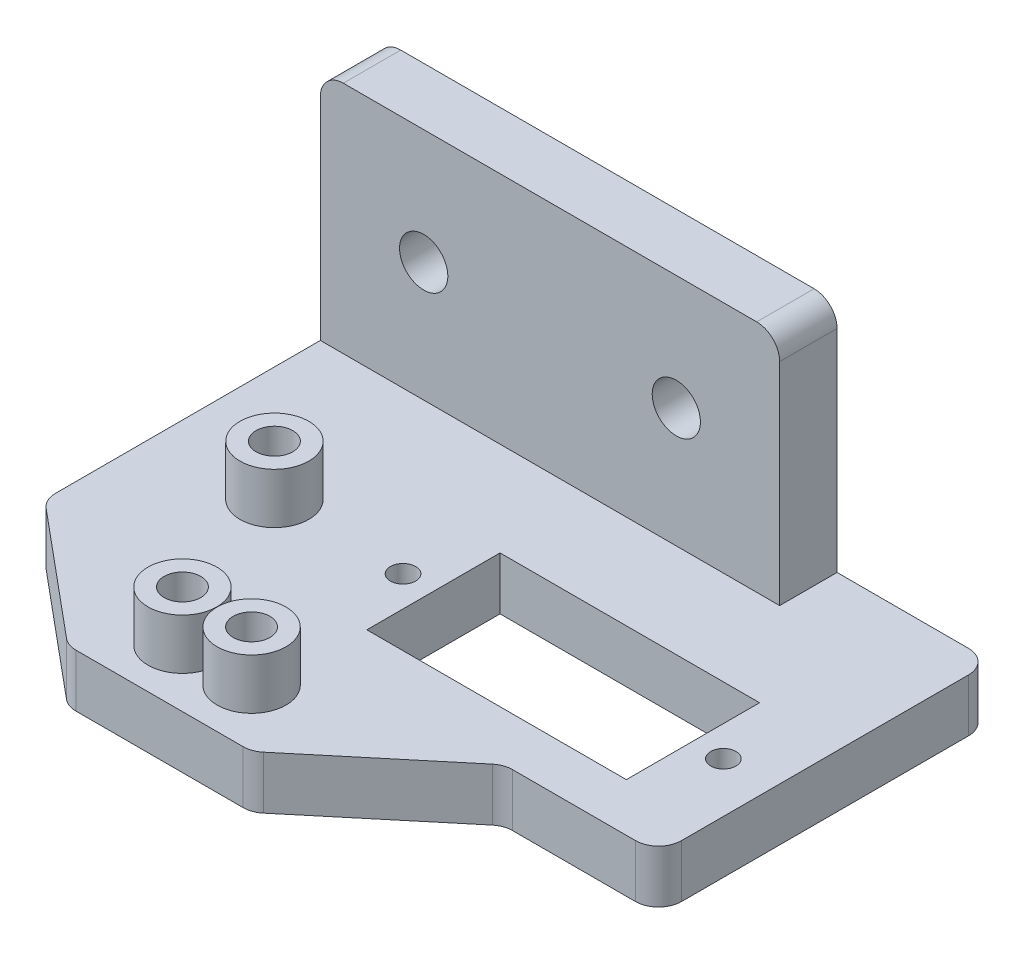
ISO-10303-21;
HEADER;
FILE_DESCRIPTION(('STEP AP214'),'2;1');
FILE_NAME('part.step','',(''),(''),'','','');
FILE_SCHEMA(('AUTOMOTIVE_DESIGN { 1 0 10303 214 1 1 1 1 }'));
ENDSEC;
DATA;
#1=APPLICATION_CONTEXT('core data for automotive mechanical design processes');
#2=APPLICATION_PROTOCOL_DEFINITION('international standard','automotive_design',2000,#1);
#3=PRODUCT_CONTEXT('',#1,'mechanical');
#4=PRODUCT('Part','Part','',(#3));
#5=PRODUCT_RELATED_PRODUCT_CATEGORY('part','',(#4));
#6=PRODUCT_DEFINITION_FORMATION('','',#4);
#7=PRODUCT_DEFINITION_CONTEXT('part definition',#1,'design');
#8=PRODUCT_DEFINITION('design','',#6,#7);
#9=PRODUCT_DEFINITION_SHAPE('','',#8);
#10=(LENGTH_UNIT() NAMED_UNIT(*) SI_UNIT(.MILLI.,.METRE.));
#11=(NAMED_UNIT(*) PLANE_ANGLE_UNIT() SI_UNIT($,.RADIAN.));
#12=(NAMED_UNIT(*) SI_UNIT($,.STERADIAN.) SOLID_ANGLE_UNIT());
#13=UNCERTAINTY_MEASURE_WITH_UNIT(LENGTH_MEASURE(1.E-05),#10,'distance_accuracy_value','');
#14=(GEOMETRIC_REPRESENTATION_CONTEXT(3) GLOBAL_UNCERTAINTY_ASSIGNED_CONTEXT((#13)) GLOBAL_UNIT_ASSIGNED_CONTEXT((#10,
#11,#12)) REPRESENTATION_CONTEXT('',''));
#15=CARTESIAN_POINT('',(0.,0.,0.));
#16=DIRECTION('',(0.,0.,1.));
#17=DIRECTION('',(1.,0.,0.));
#18=AXIS2_PLACEMENT_3D('',#15,#16,#17);
#19=CARTESIAN_POINT('',(0.,4.6,0.));
#20=DIRECTION('',(0.,1.,0.));
#21=DIRECTION('',(0.,0.,1.));
#22=AXIS2_PLACEMENT_3D('',#19,#20,#21);
#23=PLANE('',#22);
#24=DIRECTION('',(0.,0.,-1.));
#25=VECTOR('',#24,1.);
#26=CARTESIAN_POINT('',(52.,4.6,-1.5));
#27=LINE('',#26,#25);
#28=CARTESIAN_POINT('',(52.,4.6,25.5));
#29=VERTEX_POINT('',#28);
#30=CARTESIAN_POINT('',(52.,4.6,0.5));
#31=VERTEX_POINT('',#30);
#32=EDGE_CURVE('E540',#29,#31,#27,.T.);
#33=ORIENTED_EDGE('',*,*,#32,.T.);
#34=CARTESIAN_POINT('',(50.,4.6,0.5));
#35=DIRECTION('',(0.,1.,0.));
#36=DIRECTION('',(0.,0.,1.));
#37=AXIS2_PLACEMENT_3D('',#34,#35,#36);
#38=CIRCLE('',#37,2.);
#39=CARTESIAN_POINT('',(50.,4.6,-1.5));
#40=VERTEX_POINT('',#39);
#41=EDGE_CURVE('E374',#31,#40,#38,.T.);
#42=ORIENTED_EDGE('',*,*,#41,.T.);
#43=DIRECTION('',(-1.,0.,0.));
#44=VECTOR('',#43,1.);
#45=CARTESIAN_POINT('',(0.,4.6,-1.5));
#46=LINE('',#45,#44);
#47=CARTESIAN_POINT('',(38.55,4.6,-1.5));
#48=VERTEX_POINT('',#47);
#49=EDGE_CURVE('E245',#40,#48,#46,.T.);
#50=ORIENTED_EDGE('',*,*,#49,.T.);
#51=DIRECTION('',(0.,0.,-1.));
#52=VECTOR('',#51,1.);
#53=CARTESIAN_POINT('',(38.55,4.6,-1.5));
#54=LINE('',#53,#52);
#55=CARTESIAN_POINT('',(38.55,4.6,3.5));
#56=VERTEX_POINT('',#55);
#57=EDGE_CURVE('E219',#56,#48,#54,.T.);
#58=ORIENTED_EDGE('',*,*,#57,.F.);
#59=DIRECTION('',(1.,0.,0.));
#60=VECTOR('',#59,1.);
#61=CARTESIAN_POINT('',(-1.45,4.6,3.5));
#62=LINE('',#61,#60);
#63=CARTESIAN_POINT('',(-1.45,4.6,3.5));
#64=VERTEX_POINT('',#63);
#65=EDGE_CURVE('E197',#64,#56,#62,.T.);
#66=ORIENTED_EDGE('',*,*,#65,.F.);
#67=DIRECTION('',(0.,0.,1.));
#68=VECTOR('',#67,1.);
#69=CARTESIAN_POINT('',(-1.45,4.6,-1.5));
#70=LINE('',#69,#68);
#71=CARTESIAN_POINT('',(-1.45,4.6,26.5637500497888));
#72=VERTEX_POINT('',#71);
#73=EDGE_CURVE('E201',#64,#72,#70,.T.);
#74=ORIENTED_EDGE('',*,*,#73,.T.);
#75=CARTESIAN_POINT('',(0.550000000000004,4.6,26.5637500497888));
#76=DIRECTION('',(0.,1.,0.));
#77=DIRECTION('',(0.,0.,1.));
#78=AXIS2_PLACEMENT_3D('',#75,#76,#77);
#79=CIRCLE('',#78,2.);
#80=CARTESIAN_POINT('',(-0.73099869105042,4.6,28.0996674803583));
#81=VERTEX_POINT('',#80);
#82=EDGE_CURVE('E362',#72,#81,#79,.T.);
#83=ORIENTED_EDGE('',*,*,#82,.T.);
#84=DIRECTION('',(-0.767958715284731,0.,-0.640499345525213));
#85=VECTOR('',#84,1.);
#86=CARTESIAN_POINT('',(10.54,4.6,37.5));
#87=LINE('',#86,#85);
#88=CARTESIAN_POINT('',(9.98356499925279,4.6,37.0359174305695));
#89=VERTEX_POINT('',#88);
#90=EDGE_CURVE('E532',#89,#81,#87,.T.);
#91=ORIENTED_EDGE('',*,*,#90,.F.);
#92=CARTESIAN_POINT('',(11.2645636903032,4.6,35.5));
#93=DIRECTION('',(0.,1.,0.));
#94=DIRECTION('',(0.,0.,1.));
#95=AXIS2_PLACEMENT_3D('',#92,#93,#94);
#96=CIRCLE('',#95,2.);
#97=CARTESIAN_POINT('',(11.2645636903032,4.6,37.5));
#98=VERTEX_POINT('',#97);
#99=EDGE_CURVE('E365',#89,#98,#96,.T.);
#100=ORIENTED_EDGE('',*,*,#99,.T.);
#101=DIRECTION('',(1.,0.,0.));
#102=VECTOR('',#101,1.);
#103=CARTESIAN_POINT('',(0.,4.6,37.5));
#104=LINE('',#103,#102);
#105=CARTESIAN_POINT('',(25.8354178395591,4.6,37.5));
#106=VERTEX_POINT('',#105);
#107=EDGE_CURVE('E256',#98,#106,#104,.T.);
#108=ORIENTED_EDGE('',*,*,#107,.T.);
#109=CARTESIAN_POINT('',(25.8354178395591,4.6,35.5));
#110=DIRECTION('',(0.,1.,0.));
#111=DIRECTION('',(0.,0.,1.));
#112=AXIS2_PLACEMENT_3D('',#109,#110,#111);
#113=CIRCLE('',#112,2.);
#114=CARTESIAN_POINT('',(27.1164416076271,4.6,37.0358965152786));
#115=VERTEX_POINT('',#114);
#116=EDGE_CURVE('E368',#106,#115,#113,.T.);
#117=ORIENTED_EDGE('',*,*,#116,.T.);
#118=DIRECTION('',(-0.767948257639299,0.,0.640511884033985));
#119=VECTOR('',#118,1.);
#120=CARTESIAN_POINT('',(26.56,4.6,37.5));
#121=LINE('',#120,#119);
#122=CARTESIAN_POINT('',(37.9931604088525,4.6,27.9641034847214));
#123=VERTEX_POINT('',#122);
#124=EDGE_CURVE('E543',#123,#115,#121,.T.);
#125=ORIENTED_EDGE('',*,*,#124,.F.);
#126=CARTESIAN_POINT('',(39.2741841769205,4.6,29.5));
#127=DIRECTION('',(0.,1.,0.));
#128=DIRECTION('',(0.,0.,1.));
#129=AXIS2_PLACEMENT_3D('',#126,#127,#128);
#130=CIRCLE('',#129,2.);
#131=CARTESIAN_POINT('',(39.2741841769205,4.6,27.5));
#132=VERTEX_POINT('',#131);
#133=EDGE_CURVE('E425',#123,#132,#130,.F.);
#134=ORIENTED_EDGE('',*,*,#133,.T.);
#135=DIRECTION('',(-1.,0.,0.));
#136=VECTOR('',#135,1.);
#137=CARTESIAN_POINT('',(38.5496020164796,4.6,27.5));
#138=LINE('',#137,#136);
#139=CARTESIAN_POINT('',(50.,4.6,27.5));
#140=VERTEX_POINT('',#139);
#141=EDGE_CURVE('E536',#140,#132,#138,.T.);
#142=ORIENTED_EDGE('',*,*,#141,.F.);
#143=CARTESIAN_POINT('',(50.,4.6,25.5));
#144=DIRECTION('',(0.,1.,0.));
#145=DIRECTION('',(0.,0.,1.));
#146=AXIS2_PLACEMENT_3D('',#143,#144,#145);
#147=CIRCLE('',#146,2.);
#148=EDGE_CURVE('E371',#140,#29,#147,.T.);
#149=ORIENTED_EDGE('',*,*,#148,.T.);
#150=EDGE_LOOP('',(#33,#42,#50,#58,#66,#74,#83,#91,#100,#108,#117,#125,#134,#142,#149));
#151=FACE_BOUND('',#150,.T.);
#152=CARTESIAN_POINT('',(47.65,4.6,17.5));
#153=DIRECTION('',(0.,1.,0.));
#154=DIRECTION('',(0.,0.,1.));
#155=AXIS2_PLACEMENT_3D('',#152,#153,#154);
#156=CIRCLE('',#155,1.1);
#157=CARTESIAN_POINT('',(47.65,4.6,18.6));
#158=VERTEX_POINT('',#157);
#159=EDGE_CURVE('E569',#158,#158,#156,.T.);
#160=ORIENTED_EDGE('',*,*,#159,.F.);
#161=EDGE_LOOP('',(#160));
#162=FACE_BOUND('',#161,.T.);
#163=CARTESIAN_POINT('',(19.75,4.6,17.5));
#164=DIRECTION('',(0.,1.,0.));
#165=DIRECTION('',(0.,0.,1.));
#166=AXIS2_PLACEMENT_3D('',#163,#164,#165);
#167=CIRCLE('',#166,1.1);
#168=CARTESIAN_POINT('',(19.75,4.6,18.6));
#169=VERTEX_POINT('',#168);
#170=EDGE_CURVE('E573',#169,#169,#167,.T.);
#171=ORIENTED_EDGE('',*,*,#170,.F.);
#172=EDGE_LOOP('',(#171));
#173=FACE_BOUND('',#172,.T.);
#174=CARTESIAN_POINT('',(21.56,4.6,32.5));
#175=DIRECTION('',(0.,1.,0.));
#176=DIRECTION('',(0.,0.,1.));
#177=AXIS2_PLACEMENT_3D('',#174,#175,#176);
#178=CIRCLE('',#177,3.);
#179=CARTESIAN_POINT('',(21.56,4.6,35.5));
#180=VERTEX_POINT('',#179);
#181=EDGE_CURVE('E284',#180,#180,#178,.T.);
#182=ORIENTED_EDGE('',*,*,#181,.F.);
#183=EDGE_LOOP('',(#182));
#184=FACE_BOUND('',#183,.T.);
#185=CARTESIAN_POINT('',(8.55000000000001,4.6,17.5));
#186=DIRECTION('',(0.,1.,0.));
#187=DIRECTION('',(0.,0.,1.));
#188=AXIS2_PLACEMENT_3D('',#185,#186,#187);
#189=CIRCLE('',#188,3.);
#190=CARTESIAN_POINT('',(8.55000000000001,4.6,20.5));
#191=VERTEX_POINT('',#190);
#192=EDGE_CURVE('E304',#191,#191,#189,.T.);
#193=ORIENTED_EDGE('',*,*,#192,.F.);
#194=EDGE_LOOP('',(#193));
#195=FACE_BOUND('',#194,.T.);
#196=DIRECTION('',(0.,0.,1.));
#197=VECTOR('',#196,1.);
#198=CARTESIAN_POINT('',(22.4,4.6,11.7));
#199=LINE('',#198,#197);
#200=CARTESIAN_POINT('',(22.4,4.6,11.7));
#201=VERTEX_POINT('',#200);
#202=CARTESIAN_POINT('',(22.4,4.6,23.3));
#203=VERTEX_POINT('',#202);
#204=EDGE_CURVE('E303',#201,#203,#199,.T.);
#205=ORIENTED_EDGE('',*,*,#204,.F.);
#206=DIRECTION('',(-1.,0.,0.));
#207=VECTOR('',#206,1.);
#208=CARTESIAN_POINT('',(22.4,4.6,11.7));
#209=LINE('',#208,#207);
#210=CARTESIAN_POINT('',(45.,4.6,11.7));
#211=VERTEX_POINT('',#210);
#212=EDGE_CURVE('E315',#211,#201,#209,.T.);
#213=ORIENTED_EDGE('',*,*,#212,.F.);
#214=DIRECTION('',(0.,0.,-1.));
#215=VECTOR('',#214,1.);
#216=CARTESIAN_POINT('',(45.,4.6,11.7));
#217=LINE('',#216,#215);
#218=CARTESIAN_POINT('',(45.,4.6,23.3));
#219=VERTEX_POINT('',#218);
#220=EDGE_CURVE('E334',#219,#211,#217,.T.);
#221=ORIENTED_EDGE('',*,*,#220,.F.);
#222=DIRECTION('',(1.,0.,0.));
#223=VECTOR('',#222,1.);
#224=CARTESIAN_POINT('',(22.4,4.6,23.3));
#225=LINE('',#224,#223);
#226=EDGE_CURVE('E330',#203,#219,#225,.T.);
#227=ORIENTED_EDGE('',*,*,#226,.F.);
#228=EDGE_LOOP('',(#205,#213,#221,#227));
#229=FACE_BOUND('',#228,.T.);
#230=CARTESIAN_POINT('',(15.54,4.6,32.5));
#231=DIRECTION('',(0.,1.,0.));
#232=DIRECTION('',(0.,0.,1.));
#233=AXIS2_PLACEMENT_3D('',#230,#231,#232);
#234=CIRCLE('',#233,3.);
#235=CARTESIAN_POINT('',(15.54,4.6,35.5));
#236=VERTEX_POINT('',#235);
#237=EDGE_CURVE('E292',#236,#236,#234,.T.);
#238=ORIENTED_EDGE('',*,*,#237,.F.);
#239=EDGE_LOOP('',(#238));
#240=FACE_BOUND('',#239,.T.);
#241=ADVANCED_FACE('F45',(#151,#162,#173,#184,#195,#229,#240),#23,.T.);
#242=CARTESIAN_POINT('',(0.,0.,0.));
#243=DIRECTION('',(0.,1.,0.));
#244=DIRECTION('',(0.,0.,1.));
#245=AXIS2_PLACEMENT_3D('',#242,#243,#244);
#246=PLANE('',#245);
#247=CARTESIAN_POINT('',(47.65,0.,17.5));
#248=DIRECTION('',(0.,1.,0.));
#249=DIRECTION('',(0.,0.,1.));
#250=AXIS2_PLACEMENT_3D('',#247,#248,#249);
#251=CIRCLE('',#250,1.1);
#252=CARTESIAN_POINT('',(47.65,0.,18.6));
#253=VERTEX_POINT('',#252);
#254=EDGE_CURVE('E564',#253,#253,#251,.T.);
#255=ORIENTED_EDGE('',*,*,#254,.T.);
#256=EDGE_LOOP('',(#255));
#257=FACE_BOUND('',#256,.T.);
#258=CARTESIAN_POINT('',(19.75,0.,17.5));
#259=DIRECTION('',(0.,1.,0.));
#260=DIRECTION('',(0.,0.,1.));
#261=AXIS2_PLACEMENT_3D('',#258,#259,#260);
#262=CIRCLE('',#261,1.1);
#263=CARTESIAN_POINT('',(19.75,0.,18.6));
#264=VERTEX_POINT('',#263);
#265=EDGE_CURVE('E561',#264,#264,#262,.T.);
#266=ORIENTED_EDGE('',*,*,#265,.T.);
#267=EDGE_LOOP('',(#266));
#268=FACE_BOUND('',#267,.T.);
#269=CARTESIAN_POINT('',(8.55000000000001,0.,17.5));
#270=DIRECTION('',(0.,1.,0.));
#271=DIRECTION('',(0.,0.,1.));
#272=AXIS2_PLACEMENT_3D('',#269,#270,#271);
#273=CIRCLE('',#272,1.6);
#274=CARTESIAN_POINT('',(8.55000000000001,0.,19.1));
#275=VERTEX_POINT('',#274);
#276=EDGE_CURVE('E252',#275,#275,#273,.T.);
#277=ORIENTED_EDGE('',*,*,#276,.T.);
#278=EDGE_LOOP('',(#277));
#279=FACE_BOUND('',#278,.T.);
#280=CARTESIAN_POINT('',(15.54,0.,32.5));
#281=DIRECTION('',(0.,1.,0.));
#282=DIRECTION('',(0.,0.,1.));
#283=AXIS2_PLACEMENT_3D('',#280,#281,#282);
#284=CIRCLE('',#283,1.6);
#285=CARTESIAN_POINT('',(15.54,0.,34.1));
#286=VERTEX_POINT('',#285);
#287=EDGE_CURVE('E265',#286,#286,#284,.T.);
#288=ORIENTED_EDGE('',*,*,#287,.T.);
#289=EDGE_LOOP('',(#288));
#290=FACE_BOUND('',#289,.T.);
#291=CARTESIAN_POINT('',(21.56,0.,32.5));
#292=DIRECTION('',(0.,1.,0.));
#293=DIRECTION('',(0.,0.,1.));
#294=AXIS2_PLACEMENT_3D('',#291,#292,#293);
#295=CIRCLE('',#294,1.6);
#296=CARTESIAN_POINT('',(21.56,0.,34.1));
#297=VERTEX_POINT('',#296);
#298=EDGE_CURVE('E249',#297,#297,#295,.T.);
#299=ORIENTED_EDGE('',*,*,#298,.T.);
#300=EDGE_LOOP('',(#299));
#301=FACE_BOUND('',#300,.T.);
#302=DIRECTION('',(-1.,0.,0.));
#303=VECTOR('',#302,1.);
#304=CARTESIAN_POINT('',(22.4,0.,11.7));
#305=LINE('',#304,#303);
#306=CARTESIAN_POINT('',(45.,0.,11.7));
#307=VERTEX_POINT('',#306);
#308=CARTESIAN_POINT('',(22.4,0.,11.7));
#309=VERTEX_POINT('',#308);
#310=EDGE_CURVE('E323',#307,#309,#305,.T.);
#311=ORIENTED_EDGE('',*,*,#310,.T.);
#312=DIRECTION('',(0.,0.,1.));
#313=VECTOR('',#312,1.);
#314=CARTESIAN_POINT('',(22.4,0.,11.7));
#315=LINE('',#314,#313);
#316=CARTESIAN_POINT('',(22.4,0.,23.3));
#317=VERTEX_POINT('',#316);
#318=EDGE_CURVE('E310',#309,#317,#315,.T.);
#319=ORIENTED_EDGE('',*,*,#318,.T.);
#320=DIRECTION('',(1.,0.,0.));
#321=VECTOR('',#320,1.);
#322=CARTESIAN_POINT('',(22.4,0.,23.3));
#323=LINE('',#322,#321);
#324=CARTESIAN_POINT('',(45.,0.,23.3));
#325=VERTEX_POINT('',#324);
#326=EDGE_CURVE('E314',#317,#325,#323,.T.);
#327=ORIENTED_EDGE('',*,*,#326,.T.);
#328=DIRECTION('',(0.,0.,-1.));
#329=VECTOR('',#328,1.);
#330=CARTESIAN_POINT('',(45.,0.,11.7));
#331=LINE('',#330,#329);
#332=EDGE_CURVE('E319',#325,#307,#331,.T.);
#333=ORIENTED_EDGE('',*,*,#332,.T.);
#334=EDGE_LOOP('',(#311,#319,#327,#333));
#335=FACE_BOUND('',#334,.T.);
#336=DIRECTION('',(-1.,0.,0.));
#337=VECTOR('',#336,1.);
#338=CARTESIAN_POINT('',(0.,0.,-1.5));
#339=LINE('',#338,#337);
#340=CARTESIAN_POINT('',(50.,0.,-1.5));
#341=VERTEX_POINT('',#340);
#342=CARTESIAN_POINT('',(-1.45,0.,-1.5));
#343=VERTEX_POINT('',#342);
#344=EDGE_CURVE('E246',#341,#343,#339,.T.);
#345=ORIENTED_EDGE('',*,*,#344,.F.);
#346=CARTESIAN_POINT('',(50.,0.,0.5));
#347=DIRECTION('',(0.,1.,0.));
#348=DIRECTION('',(0.,0.,1.));
#349=AXIS2_PLACEMENT_3D('',#346,#347,#348);
#350=CIRCLE('',#349,2.);
#351=CARTESIAN_POINT('',(52.,0.,0.5));
#352=VERTEX_POINT('',#351);
#353=EDGE_CURVE('E392',#341,#352,#350,.F.);
#354=ORIENTED_EDGE('',*,*,#353,.T.);
#355=DIRECTION('',(0.,0.,-1.));
#356=VECTOR('',#355,1.);
#357=CARTESIAN_POINT('',(52.,0.,-1.5));
#358=LINE('',#357,#356);
#359=CARTESIAN_POINT('',(52.,0.,25.5));
#360=VERTEX_POINT('',#359);
#361=EDGE_CURVE('E557',#360,#352,#358,.T.);
#362=ORIENTED_EDGE('',*,*,#361,.F.);
#363=CARTESIAN_POINT('',(50.,0.,25.5));
#364=DIRECTION('',(0.,1.,0.));
#365=DIRECTION('',(0.,0.,1.));
#366=AXIS2_PLACEMENT_3D('',#363,#364,#365);
#367=CIRCLE('',#366,2.);
#368=CARTESIAN_POINT('',(50.,0.,27.5));
#369=VERTEX_POINT('',#368);
#370=EDGE_CURVE('E389',#360,#369,#367,.F.);
#371=ORIENTED_EDGE('',*,*,#370,.T.);
#372=DIRECTION('',(-1.,0.,0.));
#373=VECTOR('',#372,1.);
#374=CARTESIAN_POINT('',(38.5496020164796,0.,27.5));
#375=LINE('',#374,#373);
#376=CARTESIAN_POINT('',(39.2741841769205,0.,27.5));
#377=VERTEX_POINT('',#376);
#378=EDGE_CURVE('E548',#369,#377,#375,.T.);
#379=ORIENTED_EDGE('',*,*,#378,.T.);
#380=CARTESIAN_POINT('',(39.2741841769205,0.,29.5));
#381=DIRECTION('',(0.,1.,0.));
#382=DIRECTION('',(0.,0.,1.));
#383=AXIS2_PLACEMENT_3D('',#380,#381,#382);
#384=CIRCLE('',#383,2.);
#385=CARTESIAN_POINT('',(37.9931604088525,0.,27.9641034847214));
#386=VERTEX_POINT('',#385);
#387=EDGE_CURVE('E428',#377,#386,#384,.T.);
#388=ORIENTED_EDGE('',*,*,#387,.T.);
#389=DIRECTION('',(-0.767948257639299,0.,0.640511884033985));
#390=VECTOR('',#389,1.);
#391=CARTESIAN_POINT('',(26.56,0.,37.5));
#392=LINE('',#391,#390);
#393=CARTESIAN_POINT('',(27.1164416076271,0.,37.0358965152786));
#394=VERTEX_POINT('',#393);
#395=EDGE_CURVE('E550',#386,#394,#392,.T.);
#396=ORIENTED_EDGE('',*,*,#395,.T.);
#397=CARTESIAN_POINT('',(25.8354178395591,0.,35.5));
#398=DIRECTION('',(0.,1.,0.));
#399=DIRECTION('',(0.,0.,1.));
#400=AXIS2_PLACEMENT_3D('',#397,#398,#399);
#401=CIRCLE('',#400,2.);
#402=CARTESIAN_POINT('',(25.8354178395591,0.,37.5));
#403=VERTEX_POINT('',#402);
#404=EDGE_CURVE('E386',#394,#403,#401,.F.);
#405=ORIENTED_EDGE('',*,*,#404,.T.);
#406=DIRECTION('',(1.,0.,0.));
#407=VECTOR('',#406,1.);
#408=CARTESIAN_POINT('',(0.,0.,37.5));
#409=LINE('',#408,#407);
#410=CARTESIAN_POINT('',(11.2645636903032,0.,37.5));
#411=VERTEX_POINT('',#410);
#412=EDGE_CURVE('E276',#411,#403,#409,.T.);
#413=ORIENTED_EDGE('',*,*,#412,.F.);
#414=CARTESIAN_POINT('',(11.2645636903032,0.,35.5));
#415=DIRECTION('',(0.,1.,0.));
#416=DIRECTION('',(0.,0.,1.));
#417=AXIS2_PLACEMENT_3D('',#414,#415,#416);
#418=CIRCLE('',#417,2.);
#419=CARTESIAN_POINT('',(9.98356499925279,0.,37.0359174305695));
#420=VERTEX_POINT('',#419);
#421=EDGE_CURVE('E383',#411,#420,#418,.F.);
#422=ORIENTED_EDGE('',*,*,#421,.T.);
#423=DIRECTION('',(-0.767958715284731,0.,-0.640499345525213));
#424=VECTOR('',#423,1.);
#425=CARTESIAN_POINT('',(10.54,0.,37.5));
#426=LINE('',#425,#424);
#427=CARTESIAN_POINT('',(-0.73099869105042,0.,28.0996674803583));
#428=VERTEX_POINT('',#427);
#429=EDGE_CURVE('E528',#420,#428,#426,.T.);
#430=ORIENTED_EDGE('',*,*,#429,.T.);
#431=CARTESIAN_POINT('',(0.550000000000004,0.,26.5637500497888));
#432=DIRECTION('',(0.,1.,0.));
#433=DIRECTION('',(0.,0.,1.));
#434=AXIS2_PLACEMENT_3D('',#431,#432,#433);
#435=CIRCLE('',#434,2.);
#436=CARTESIAN_POINT('',(-1.45,0.,26.5637500497888));
#437=VERTEX_POINT('',#436);
#438=EDGE_CURVE('E380',#428,#437,#435,.F.);
#439=ORIENTED_EDGE('',*,*,#438,.T.);
#440=DIRECTION('',(0.,0.,1.));
#441=VECTOR('',#440,1.);
#442=CARTESIAN_POINT('',(-1.45,0.,-1.5));
#443=LINE('',#442,#441);
#444=EDGE_CURVE('E212',#343,#437,#443,.T.);
#445=ORIENTED_EDGE('',*,*,#444,.F.);
#446=EDGE_LOOP('',(#345,#354,#362,#371,#379,#388,#396,#405,#413,#422,#430,#439,#445));
#447=FACE_BOUND('',#446,.T.);
#448=ADVANCED_FACE('F475',(#257,#268,#279,#290,#301,#335,#447),#246,.F.);
#449=CARTESIAN_POINT('',(22.4,0.,11.7));
#450=DIRECTION('',(-1.,0.,0.));
#451=DIRECTION('',(0.,0.,1.));
#452=AXIS2_PLACEMENT_3D('',#449,#450,#451);
#453=PLANE('',#452);
#454=ORIENTED_EDGE('',*,*,#204,.T.);
#455=DIRECTION('',(0.,1.,0.));
#456=VECTOR('',#455,1.);
#457=CARTESIAN_POINT('',(22.4,0.,23.3));
#458=LINE('',#457,#456);
#459=EDGE_CURVE('E327',#317,#203,#458,.T.);
#460=ORIENTED_EDGE('',*,*,#459,.F.);
#461=ORIENTED_EDGE('',*,*,#318,.F.);
#462=DIRECTION('',(0.,1.,0.));
#463=VECTOR('',#462,1.);
#464=CARTESIAN_POINT('',(22.4,0.,11.7));
#465=LINE('',#464,#463);
#466=EDGE_CURVE('E309',#309,#201,#465,.T.);
#467=ORIENTED_EDGE('',*,*,#466,.T.);
#468=EDGE_LOOP('',(#454,#460,#461,#467));
#469=FACE_BOUND('',#468,.T.);
#470=ADVANCED_FACE('F481',(#469),#453,.F.);
#471=CARTESIAN_POINT('',(22.4,0.,11.7));
#472=DIRECTION('',(0.,0.,-1.));
#473=DIRECTION('',(-1.,0.,0.));
#474=AXIS2_PLACEMENT_3D('',#471,#472,#473);
#475=PLANE('',#474);
#476=ORIENTED_EDGE('',*,*,#212,.T.);
#477=ORIENTED_EDGE('',*,*,#466,.F.);
#478=ORIENTED_EDGE('',*,*,#310,.F.);
#479=DIRECTION('',(0.,1.,0.));
#480=VECTOR('',#479,1.);
#481=CARTESIAN_POINT('',(45.,0.,11.7));
#482=LINE('',#481,#480);
#483=EDGE_CURVE('E343',#307,#211,#482,.T.);
#484=ORIENTED_EDGE('',*,*,#483,.T.);
#485=EDGE_LOOP('',(#476,#477,#478,#484));
#486=FACE_BOUND('',#485,.T.);
#487=ADVANCED_FACE('F639',(#486),#475,.F.);
#488=CARTESIAN_POINT('',(45.,0.,11.7));
#489=DIRECTION('',(1.,0.,0.));
#490=DIRECTION('',(0.,0.,-1.));
#491=AXIS2_PLACEMENT_3D('',#488,#489,#490);
#492=PLANE('',#491);
#493=ORIENTED_EDGE('',*,*,#220,.T.);
#494=ORIENTED_EDGE('',*,*,#483,.F.);
#495=ORIENTED_EDGE('',*,*,#332,.F.);
#496=DIRECTION('',(0.,1.,0.));
#497=VECTOR('',#496,1.);
#498=CARTESIAN_POINT('',(45.,0.,23.3));
#499=LINE('',#498,#497);
#500=EDGE_CURVE('E346',#325,#219,#499,.T.);
#501=ORIENTED_EDGE('',*,*,#500,.T.);
#502=EDGE_LOOP('',(#493,#494,#495,#501));
#503=FACE_BOUND('',#502,.T.);
#504=ADVANCED_FACE('F642',(#503),#492,.F.);
#505=CARTESIAN_POINT('',(22.4,0.,23.3));
#506=DIRECTION('',(0.,0.,1.));
#507=DIRECTION('',(1.,0.,0.));
#508=AXIS2_PLACEMENT_3D('',#505,#506,#507);
#509=PLANE('',#508);
#510=ORIENTED_EDGE('',*,*,#226,.T.);
#511=ORIENTED_EDGE('',*,*,#500,.F.);
#512=ORIENTED_EDGE('',*,*,#326,.F.);
#513=ORIENTED_EDGE('',*,*,#459,.T.);
#514=EDGE_LOOP('',(#510,#511,#512,#513));
#515=FACE_BOUND('',#514,.T.);
#516=ADVANCED_FACE('F637',(#515),#509,.F.);
#517=CARTESIAN_POINT('',(8.55000000000001,9.,17.5));
#518=DIRECTION('',(0.,-1.,0.));
#519=DIRECTION('',(0.,0.,-1.));
#520=AXIS2_PLACEMENT_3D('',#517,#518,#519);
#521=CYLINDRICAL_SURFACE('',#520,3.);
#522=CARTESIAN_POINT('',(8.55000000000001,9.,17.5));
#523=DIRECTION('',(0.,1.,0.));
#524=DIRECTION('',(0.,0.,1.));
#525=AXIS2_PLACEMENT_3D('',#522,#523,#524);
#526=CIRCLE('',#525,3.);
#527=CARTESIAN_POINT('',(8.55000000000001,9.,20.5));
#528=VERTEX_POINT('',#527);
#529=EDGE_CURVE('E296',#528,#528,#526,.T.);
#530=ORIENTED_EDGE('',*,*,#529,.F.);
#531=EDGE_LOOP('',(#530));
#532=FACE_BOUND('',#531,.T.);
#533=ORIENTED_EDGE('',*,*,#192,.T.);
#534=EDGE_LOOP('',(#533));
#535=FACE_BOUND('',#534,.T.);
#536=ADVANCED_FACE('F633',(#532,#535),#521,.T.);
#537=CARTESIAN_POINT('',(8.55000000000001,9.,17.5));
#538=DIRECTION('',(0.,1.,0.));
#539=DIRECTION('',(0.,0.,1.));
#540=AXIS2_PLACEMENT_3D('',#537,#538,#539);
#541=PLANE('',#540);
#542=CARTESIAN_POINT('',(8.55000000000001,9.,17.5));
#543=DIRECTION('',(0.,1.,0.));
#544=DIRECTION('',(0.,0.,1.));
#545=AXIS2_PLACEMENT_3D('',#542,#543,#544);
#546=CIRCLE('',#545,1.6);
#547=CARTESIAN_POINT('',(8.55000000000001,9.,19.1));
#548=VERTEX_POINT('',#547);
#549=EDGE_CURVE('E257',#548,#548,#546,.T.);
#550=ORIENTED_EDGE('',*,*,#549,.F.);
#551=EDGE_LOOP('',(#550));
#552=FACE_BOUND('',#551,.T.);
#553=ORIENTED_EDGE('',*,*,#529,.T.);
#554=EDGE_LOOP('',(#553));
#555=FACE_BOUND('',#554,.T.);
#556=ADVANCED_FACE('F626',(#552,#555),#541,.T.);
#557=CARTESIAN_POINT('',(15.54,9.,32.5));
#558=DIRECTION('',(0.,-1.,0.));
#559=DIRECTION('',(0.,0.,-1.));
#560=AXIS2_PLACEMENT_3D('',#557,#558,#559);
#561=CYLINDRICAL_SURFACE('',#560,3.);
#562=CARTESIAN_POINT('',(15.54,9.,32.5));
#563=DIRECTION('',(0.,1.,0.));
#564=DIRECTION('',(0.,0.,1.));
#565=AXIS2_PLACEMENT_3D('',#562,#563,#564);
#566=CIRCLE('',#565,3.);
#567=CARTESIAN_POINT('',(15.54,9.,35.5));
#568=VERTEX_POINT('',#567);
#569=EDGE_CURVE('E288',#568,#568,#566,.T.);
#570=ORIENTED_EDGE('',*,*,#569,.F.);
#571=EDGE_LOOP('',(#570));
#572=FACE_BOUND('',#571,.T.);
#573=ORIENTED_EDGE('',*,*,#237,.T.);
#574=EDGE_LOOP('',(#573));
#575=FACE_BOUND('',#574,.T.);
#576=ADVANCED_FACE('F623',(#572,#575),#561,.T.);
#577=CARTESIAN_POINT('',(15.54,9.,32.5));
#578=DIRECTION('',(0.,1.,0.));
#579=DIRECTION('',(0.,0.,1.));
#580=AXIS2_PLACEMENT_3D('',#577,#578,#579);
#581=PLANE('',#580);
#582=CARTESIAN_POINT('',(15.54,9.,32.5));
#583=DIRECTION('',(0.,1.,0.));
#584=DIRECTION('',(0.,0.,1.));
#585=AXIS2_PLACEMENT_3D('',#582,#583,#584);
#586=CIRCLE('',#585,1.6);
#587=CARTESIAN_POINT('',(15.54,9.,34.1));
#588=VERTEX_POINT('',#587);
#589=EDGE_CURVE('E261',#588,#588,#586,.T.);
#590=ORIENTED_EDGE('',*,*,#589,.F.);
#591=EDGE_LOOP('',(#590));
#592=FACE_BOUND('',#591,.T.);
#593=ORIENTED_EDGE('',*,*,#569,.T.);
#594=EDGE_LOOP('',(#593));
#595=FACE_BOUND('',#594,.T.);
#596=ADVANCED_FACE('F618',(#592,#595),#581,.T.);
#597=CARTESIAN_POINT('',(21.56,9.,32.5));
#598=DIRECTION('',(0.,-1.,0.));
#599=DIRECTION('',(0.,0.,-1.));
#600=AXIS2_PLACEMENT_3D('',#597,#598,#599);
#601=CYLINDRICAL_SURFACE('',#600,3.);
#602=CARTESIAN_POINT('',(21.56,9.,32.5));
#603=DIRECTION('',(0.,1.,0.));
#604=DIRECTION('',(0.,0.,1.));
#605=AXIS2_PLACEMENT_3D('',#602,#603,#604);
#606=CIRCLE('',#605,3.);
#607=CARTESIAN_POINT('',(21.56,9.,35.5));
#608=VERTEX_POINT('',#607);
#609=EDGE_CURVE('E280',#608,#608,#606,.T.);
#610=ORIENTED_EDGE('',*,*,#609,.F.);
#611=EDGE_LOOP('',(#610));
#612=FACE_BOUND('',#611,.T.);
#613=ORIENTED_EDGE('',*,*,#181,.T.);
#614=EDGE_LOOP('',(#613));
#615=FACE_BOUND('',#614,.T.);
#616=ADVANCED_FACE('F615',(#612,#615),#601,.T.);
#617=CARTESIAN_POINT('',(21.56,9.,32.5));
#618=DIRECTION('',(0.,1.,0.));
#619=DIRECTION('',(0.,0.,1.));
#620=AXIS2_PLACEMENT_3D('',#617,#618,#619);
#621=PLANE('',#620);
#622=CARTESIAN_POINT('',(21.56,9.,32.5));
#623=DIRECTION('',(0.,1.,0.));
#624=DIRECTION('',(0.,0.,1.));
#625=AXIS2_PLACEMENT_3D('',#622,#623,#624);
#626=CIRCLE('',#625,1.6);
#627=CARTESIAN_POINT('',(21.56,9.,34.1));
#628=VERTEX_POINT('',#627);
#629=EDGE_CURVE('E269',#628,#628,#626,.T.);
#630=ORIENTED_EDGE('',*,*,#629,.F.);
#631=EDGE_LOOP('',(#630));
#632=FACE_BOUND('',#631,.T.);
#633=ORIENTED_EDGE('',*,*,#609,.T.);
#634=EDGE_LOOP('',(#633));
#635=FACE_BOUND('',#634,.T.);
#636=ADVANCED_FACE('F613',(#632,#635),#621,.T.);
#637=CARTESIAN_POINT('',(0.,0.,37.5));
#638=DIRECTION('',(0.,0.,1.));
#639=DIRECTION('',(1.,0.,0.));
#640=AXIS2_PLACEMENT_3D('',#637,#638,#639);
#641=PLANE('',#640);
#642=ORIENTED_EDGE('',*,*,#412,.T.);
#643=DIRECTION('',(0.,1.,0.));
#644=VECTOR('',#643,1.);
#645=CARTESIAN_POINT('',(25.8354178395591,4.6,37.5));
#646=LINE('',#645,#644);
#647=EDGE_CURVE('E405',#403,#106,#646,.T.);
#648=ORIENTED_EDGE('',*,*,#647,.T.);
#649=ORIENTED_EDGE('',*,*,#107,.F.);
#650=DIRECTION('',(0.,1.,0.));
#651=VECTOR('',#650,1.);
#652=CARTESIAN_POINT('',(11.2645636903032,0.,37.5));
#653=LINE('',#652,#651);
#654=EDGE_CURVE('E402',#98,#411,#653,.F.);
#655=ORIENTED_EDGE('',*,*,#654,.T.);
#656=EDGE_LOOP('',(#642,#648,#649,#655));
#657=FACE_BOUND('',#656,.T.);
#658=ADVANCED_FACE('F609',(#657),#641,.T.);
#659=CARTESIAN_POINT('',(21.56,0.,32.5));
#660=DIRECTION('',(0.,1.,0.));
#661=DIRECTION('',(0.,0.,1.));
#662=AXIS2_PLACEMENT_3D('',#659,#660,#661);
#663=CYLINDRICAL_SURFACE('',#662,1.6);
#664=ORIENTED_EDGE('',*,*,#298,.F.);
#665=EDGE_LOOP('',(#664));
#666=FACE_BOUND('',#665,.T.);
#667=ORIENTED_EDGE('',*,*,#629,.T.);
#668=EDGE_LOOP('',(#667));
#669=FACE_BOUND('',#668,.T.);
#670=ADVANCED_FACE('F605',(#666,#669),#663,.F.);
#671=CARTESIAN_POINT('',(15.54,0.,32.5));
#672=DIRECTION('',(0.,1.,0.));
#673=DIRECTION('',(0.,0.,1.));
#674=AXIS2_PLACEMENT_3D('',#671,#672,#673);
#675=CYLINDRICAL_SURFACE('',#674,1.6);
#676=ORIENTED_EDGE('',*,*,#287,.F.);
#677=EDGE_LOOP('',(#676));
#678=FACE_BOUND('',#677,.T.);
#679=ORIENTED_EDGE('',*,*,#589,.T.);
#680=EDGE_LOOP('',(#679));
#681=FACE_BOUND('',#680,.T.);
#682=ADVANCED_FACE('F598',(#678,#681),#675,.F.);
#683=CARTESIAN_POINT('',(8.55000000000001,0.,17.5));
#684=DIRECTION('',(0.,1.,0.));
#685=DIRECTION('',(0.,0.,1.));
#686=AXIS2_PLACEMENT_3D('',#683,#684,#685);
#687=CYLINDRICAL_SURFACE('',#686,1.6);
#688=ORIENTED_EDGE('',*,*,#276,.F.);
#689=EDGE_LOOP('',(#688));
#690=FACE_BOUND('',#689,.T.);
#691=ORIENTED_EDGE('',*,*,#549,.T.);
#692=EDGE_LOOP('',(#691));
#693=FACE_BOUND('',#692,.T.);
#694=ADVANCED_FACE('F590',(#690,#693),#687,.F.);
#695=CARTESIAN_POINT('',(0.,0.,-1.5));
#696=DIRECTION('',(0.,0.,-1.));
#697=DIRECTION('',(-1.,0.,0.));
#698=AXIS2_PLACEMENT_3D('',#695,#696,#697);
#699=PLANE('',#698);
#700=CARTESIAN_POINT('',(29.55,15.,-1.5));
#701=DIRECTION('',(0.,0.,-1.));
#702=DIRECTION('',(-1.,0.,0.));
#703=AXIS2_PLACEMENT_3D('',#700,#701,#702);
#704=CIRCLE('',#703,2.1);
#705=CARTESIAN_POINT('',(27.45,15.,-1.5));
#706=VERTEX_POINT('',#705);
#707=EDGE_CURVE('E354',#706,#706,#704,.T.);
#708=ORIENTED_EDGE('',*,*,#707,.F.);
#709=EDGE_LOOP('',(#708));
#710=FACE_BOUND('',#709,.T.);
#711=CARTESIAN_POINT('',(7.55,15.,-1.5));
#712=DIRECTION('',(0.,0.,-1.));
#713=DIRECTION('',(-1.,0.,0.));
#714=AXIS2_PLACEMENT_3D('',#711,#712,#713);
#715=CIRCLE('',#714,2.1);
#716=CARTESIAN_POINT('',(5.45,15.,-1.5));
#717=VERTEX_POINT('',#716);
#718=EDGE_CURVE('E568',#717,#717,#715,.T.);
#719=ORIENTED_EDGE('',*,*,#718,.F.);
#720=EDGE_LOOP('',(#719));
#721=FACE_BOUND('',#720,.T.);
#722=DIRECTION('',(-1.,0.,0.));
#723=VECTOR('',#722,1.);
#724=CARTESIAN_POINT('',(-1.45,25.,-1.5));
#725=LINE('',#724,#723);
#726=CARTESIAN_POINT('',(36.55,25.,-1.5));
#727=VERTEX_POINT('',#726);
#728=CARTESIAN_POINT('',(0.550000000000001,25.,-1.5));
#729=VERTEX_POINT('',#728);
#730=EDGE_CURVE('E231',#727,#729,#725,.T.);
#731=ORIENTED_EDGE('',*,*,#730,.F.);
#732=CARTESIAN_POINT('',(36.55,23.,-1.5));
#733=DIRECTION('',(0.,0.,-1.));
#734=DIRECTION('',(-1.,0.,0.));
#735=AXIS2_PLACEMENT_3D('',#732,#733,#734);
#736=CIRCLE('',#735,2.);
#737=CARTESIAN_POINT('',(38.55,23.,-1.5));
#738=VERTEX_POINT('',#737);
#739=EDGE_CURVE('E442',#727,#738,#736,.T.);
#740=ORIENTED_EDGE('',*,*,#739,.T.);
#741=DIRECTION('',(0.,-1.,0.));
#742=VECTOR('',#741,1.);
#743=CARTESIAN_POINT('',(38.55,25.,-1.5));
#744=LINE('',#743,#742);
#745=EDGE_CURVE('E234',#738,#48,#744,.T.);
#746=ORIENTED_EDGE('',*,*,#745,.T.);
#747=ORIENTED_EDGE('',*,*,#49,.F.);
#748=DIRECTION('',(0.,1.,0.));
#749=VECTOR('',#748,1.);
#750=CARTESIAN_POINT('',(50.,0.,-1.5));
#751=LINE('',#750,#749);
#752=EDGE_CURVE('E377',#40,#341,#751,.F.);
#753=ORIENTED_EDGE('',*,*,#752,.T.);
#754=ORIENTED_EDGE('',*,*,#344,.T.);
#755=DIRECTION('',(0.,1.,0.));
#756=VECTOR('',#755,1.);
#757=CARTESIAN_POINT('',(-1.45,0.,-1.5));
#758=LINE('',#757,#756);
#759=CARTESIAN_POINT('',(-1.45,23.,-1.5));
#760=VERTEX_POINT('',#759);
#761=EDGE_CURVE('E240',#343,#760,#758,.T.);
#762=ORIENTED_EDGE('',*,*,#761,.T.);
#763=CARTESIAN_POINT('',(0.550000000000001,23.,-1.5));
#764=DIRECTION('',(0.,0.,-1.));
#765=DIRECTION('',(-1.,0.,0.));
#766=AXIS2_PLACEMENT_3D('',#763,#764,#765);
#767=CIRCLE('',#766,2.);
#768=EDGE_CURVE('E439',#760,#729,#767,.T.);
#769=ORIENTED_EDGE('',*,*,#768,.T.);
#770=EDGE_LOOP('',(#731,#740,#746,#747,#753,#754,#762,#769));
#771=FACE_BOUND('',#770,.T.);
#772=ADVANCED_FACE('F461',(#710,#721,#771),#699,.T.);
#773=CARTESIAN_POINT('',(-1.45,0.,-1.5));
#774=DIRECTION('',(-1.,0.,0.));
#775=DIRECTION('',(0.,0.,1.));
#776=AXIS2_PLACEMENT_3D('',#773,#774,#775);
#777=PLANE('',#776);
#778=DIRECTION('',(0.,-1.,0.));
#779=VECTOR('',#778,1.);
#780=CARTESIAN_POINT('',(-1.45,25.,3.5));
#781=LINE('',#780,#779);
#782=CARTESIAN_POINT('',(-1.45,23.,3.5));
#783=VERTEX_POINT('',#782);
#784=EDGE_CURVE('E193',#783,#64,#781,.T.);
#785=ORIENTED_EDGE('',*,*,#784,.F.);
#786=DIRECTION('',(0.,0.,1.));
#787=VECTOR('',#786,1.);
#788=CARTESIAN_POINT('',(-1.45,23.,-1.5));
#789=LINE('',#788,#787);
#790=EDGE_CURVE('E11',#783,#760,#789,.F.);
#791=ORIENTED_EDGE('',*,*,#790,.T.);
#792=ORIENTED_EDGE('',*,*,#761,.F.);
#793=ORIENTED_EDGE('',*,*,#444,.T.);
#794=DIRECTION('',(0.,1.,0.));
#795=VECTOR('',#794,1.);
#796=CARTESIAN_POINT('',(-1.45,4.6,26.5637500497888));
#797=LINE('',#796,#795);
#798=EDGE_CURVE('E209',#437,#72,#797,.T.);
#799=ORIENTED_EDGE('',*,*,#798,.T.);
#800=ORIENTED_EDGE('',*,*,#73,.F.);
#801=EDGE_LOOP('',(#785,#791,#792,#793,#799,#800));
#802=FACE_BOUND('',#801,.T.);
#803=ADVANCED_FACE('F206',(#802),#777,.T.);
#804=CARTESIAN_POINT('',(-1.45,25.,3.5));
#805=DIRECTION('',(0.,0.,-1.));
#806=DIRECTION('',(-1.,0.,0.));
#807=AXIS2_PLACEMENT_3D('',#804,#805,#806);
#808=PLANE('',#807);
#809=CARTESIAN_POINT('',(29.55,15.,3.5));
#810=DIRECTION('',(0.,0.,-1.));
#811=DIRECTION('',(-1.,0.,0.));
#812=AXIS2_PLACEMENT_3D('',#809,#810,#811);
#813=CIRCLE('',#812,2.1);
#814=CARTESIAN_POINT('',(27.45,15.,3.5));
#815=VERTEX_POINT('',#814);
#816=EDGE_CURVE('E221',#815,#815,#813,.T.);
#817=ORIENTED_EDGE('',*,*,#816,.T.);
#818=EDGE_LOOP('',(#817));
#819=FACE_BOUND('',#818,.T.);
#820=CARTESIAN_POINT('',(7.55,15.,3.5));
#821=DIRECTION('',(0.,0.,-1.));
#822=DIRECTION('',(-1.,0.,0.));
#823=AXIS2_PLACEMENT_3D('',#820,#821,#822);
#824=CIRCLE('',#823,2.1);
#825=CARTESIAN_POINT('',(5.45,15.,3.5));
#826=VERTEX_POINT('',#825);
#827=EDGE_CURVE('E228',#826,#826,#824,.T.);
#828=ORIENTED_EDGE('',*,*,#827,.T.);
#829=EDGE_LOOP('',(#828));
#830=FACE_BOUND('',#829,.T.);
#831=DIRECTION('',(0.,-1.,0.));
#832=VECTOR('',#831,1.);
#833=CARTESIAN_POINT('',(38.55,25.,3.5));
#834=LINE('',#833,#832);
#835=CARTESIAN_POINT('',(38.55,23.,3.5));
#836=VERTEX_POINT('',#835);
#837=EDGE_CURVE('E202',#836,#56,#834,.T.);
#838=ORIENTED_EDGE('',*,*,#837,.F.);
#839=CARTESIAN_POINT('',(36.55,23.,3.5));
#840=DIRECTION('',(0.,0.,-1.));
#841=DIRECTION('',(-1.,0.,0.));
#842=AXIS2_PLACEMENT_3D('',#839,#840,#841);
#843=CIRCLE('',#842,2.);
#844=CARTESIAN_POINT('',(36.55,25.,3.5));
#845=VERTEX_POINT('',#844);
#846=EDGE_CURVE('E54',#836,#845,#843,.F.);
#847=ORIENTED_EDGE('',*,*,#846,.T.);
#848=DIRECTION('',(1.,0.,0.));
#849=VECTOR('',#848,1.);
#850=CARTESIAN_POINT('',(-1.45,25.,3.5));
#851=LINE('',#850,#849);
#852=CARTESIAN_POINT('',(0.550000000000002,25.,3.5));
#853=VERTEX_POINT('',#852);
#854=EDGE_CURVE('E225',#853,#845,#851,.T.);
#855=ORIENTED_EDGE('',*,*,#854,.F.);
#856=CARTESIAN_POINT('',(0.550000000000002,23.,3.5));
#857=DIRECTION('',(0.,0.,-1.));
#858=DIRECTION('',(-1.,0.,0.));
#859=AXIS2_PLACEMENT_3D('',#856,#857,#858);
#860=CIRCLE('',#859,2.);
#861=EDGE_CURVE('E61',#853,#783,#860,.F.);
#862=ORIENTED_EDGE('',*,*,#861,.T.);
#863=ORIENTED_EDGE('',*,*,#784,.T.);
#864=ORIENTED_EDGE('',*,*,#65,.T.);
#865=EDGE_LOOP('',(#838,#847,#855,#862,#863,#864));
#866=FACE_BOUND('',#865,.T.);
#867=ADVANCED_FACE('F195',(#819,#830,#866),#808,.F.);
#868=CARTESIAN_POINT('',(38.55,25.,-1.5));
#869=DIRECTION('',(-1.,0.,0.));
#870=DIRECTION('',(0.,0.,1.));
#871=AXIS2_PLACEMENT_3D('',#868,#869,#870);
#872=PLANE('',#871);
#873=ORIENTED_EDGE('',*,*,#745,.F.);
#874=DIRECTION('',(0.,0.,-1.));
#875=VECTOR('',#874,1.);
#876=CARTESIAN_POINT('',(38.55,23.,3.5));
#877=LINE('',#876,#875);
#878=EDGE_CURVE('E69',#738,#836,#877,.F.);
#879=ORIENTED_EDGE('',*,*,#878,.T.);
#880=ORIENTED_EDGE('',*,*,#837,.T.);
#881=ORIENTED_EDGE('',*,*,#57,.T.);
#882=EDGE_LOOP('',(#873,#879,#880,#881));
#883=FACE_BOUND('',#882,.T.);
#884=ADVANCED_FACE('F463',(#883),#872,.F.);
#885=CARTESIAN_POINT('',(0.,25.,0.));
#886=DIRECTION('',(0.,1.,0.));
#887=DIRECTION('',(0.,0.,1.));
#888=AXIS2_PLACEMENT_3D('',#885,#886,#887);
#889=PLANE('',#888);
#890=ORIENTED_EDGE('',*,*,#854,.T.);
#891=DIRECTION('',(0.,0.,-1.));
#892=VECTOR('',#891,1.);
#893=CARTESIAN_POINT('',(36.55,25.,-1.5));
#894=LINE('',#893,#892);
#895=EDGE_CURVE('E435',#845,#727,#894,.T.);
#896=ORIENTED_EDGE('',*,*,#895,.T.);
#897=ORIENTED_EDGE('',*,*,#730,.T.);
#898=DIRECTION('',(0.,0.,1.));
#899=VECTOR('',#898,1.);
#900=CARTESIAN_POINT('',(0.550000000000001,25.,0.));
#901=LINE('',#900,#899);
#902=EDGE_CURVE('E431',#729,#853,#901,.T.);
#903=ORIENTED_EDGE('',*,*,#902,.T.);
#904=EDGE_LOOP('',(#890,#896,#897,#903));
#905=FACE_BOUND('',#904,.T.);
#906=ADVANCED_FACE('F454',(#905),#889,.T.);
#907=CARTESIAN_POINT('',(7.55,15.,37.5));
#908=DIRECTION('',(0.,0.,-1.));
#909=DIRECTION('',(-1.,0.,0.));
#910=AXIS2_PLACEMENT_3D('',#907,#908,#909);
#911=CYLINDRICAL_SURFACE('',#910,2.1);
#912=ORIENTED_EDGE('',*,*,#718,.T.);
#913=EDGE_LOOP('',(#912));
#914=FACE_BOUND('',#913,.T.);
#915=ORIENTED_EDGE('',*,*,#827,.F.);
#916=EDGE_LOOP('',(#915));
#917=FACE_BOUND('',#916,.T.);
#918=ADVANCED_FACE('F470',(#914,#917),#911,.F.);
#919=CARTESIAN_POINT('',(29.55,15.,37.5));
#920=DIRECTION('',(0.,0.,-1.));
#921=DIRECTION('',(-1.,0.,0.));
#922=AXIS2_PLACEMENT_3D('',#919,#920,#921);
#923=CYLINDRICAL_SURFACE('',#922,2.1);
#924=ORIENTED_EDGE('',*,*,#707,.T.);
#925=EDGE_LOOP('',(#924));
#926=FACE_BOUND('',#925,.T.);
#927=ORIENTED_EDGE('',*,*,#816,.F.);
#928=EDGE_LOOP('',(#927));
#929=FACE_BOUND('',#928,.T.);
#930=ADVANCED_FACE('F764',(#926,#929),#923,.F.);
#931=CARTESIAN_POINT('',(19.75,0.,17.5));
#932=DIRECTION('',(0.,1.,0.));
#933=DIRECTION('',(0.,0.,1.));
#934=AXIS2_PLACEMENT_3D('',#931,#932,#933);
#935=CYLINDRICAL_SURFACE('',#934,1.1);
#936=ORIENTED_EDGE('',*,*,#265,.F.);
#937=EDGE_LOOP('',(#936));
#938=FACE_BOUND('',#937,.T.);
#939=ORIENTED_EDGE('',*,*,#170,.T.);
#940=EDGE_LOOP('',(#939));
#941=FACE_BOUND('',#940,.T.);
#942=ADVANCED_FACE('F773',(#938,#941),#935,.F.);
#943=CARTESIAN_POINT('',(47.65,0.,17.5));
#944=DIRECTION('',(0.,1.,0.));
#945=DIRECTION('',(0.,0.,1.));
#946=AXIS2_PLACEMENT_3D('',#943,#944,#945);
#947=CYLINDRICAL_SURFACE('',#946,1.1);
#948=ORIENTED_EDGE('',*,*,#254,.F.);
#949=EDGE_LOOP('',(#948));
#950=FACE_BOUND('',#949,.T.);
#951=ORIENTED_EDGE('',*,*,#159,.T.);
#952=EDGE_LOOP('',(#951));
#953=FACE_BOUND('',#952,.T.);
#954=ADVANCED_FACE('F781',(#950,#953),#947,.F.);
#955=CARTESIAN_POINT('',(52.,0.,-1.5));
#956=DIRECTION('',(1.,0.,0.));
#957=DIRECTION('',(0.,0.,-1.));
#958=AXIS2_PLACEMENT_3D('',#955,#956,#957);
#959=PLANE('',#958);
#960=ORIENTED_EDGE('',*,*,#361,.T.);
#961=DIRECTION('',(0.,1.,0.));
#962=VECTOR('',#961,1.);
#963=CARTESIAN_POINT('',(52.,0.,0.5));
#964=LINE('',#963,#962);
#965=EDGE_CURVE('E358',#352,#31,#964,.T.);
#966=ORIENTED_EDGE('',*,*,#965,.T.);
#967=ORIENTED_EDGE('',*,*,#32,.F.);
#968=DIRECTION('',(0.,1.,0.));
#969=VECTOR('',#968,1.);
#970=CARTESIAN_POINT('',(52.,0.,25.5));
#971=LINE('',#970,#969);
#972=EDGE_CURVE('E308',#29,#360,#971,.F.);
#973=ORIENTED_EDGE('',*,*,#972,.T.);
#974=EDGE_LOOP('',(#960,#966,#967,#973));
#975=FACE_BOUND('',#974,.T.);
#976=ADVANCED_FACE('F789',(#975),#959,.T.);
#977=CARTESIAN_POINT('',(26.56,0.,37.5));
#978=DIRECTION('',(-0.640511884033985,0.,-0.767948257639299));
#979=DIRECTION('',(-0.767948257639299,0.,0.640511884033985));
#980=AXIS2_PLACEMENT_3D('',#977,#978,#979);
#981=PLANE('',#980);
#982=ORIENTED_EDGE('',*,*,#124,.T.);
#983=DIRECTION('',(0.,1.,0.));
#984=VECTOR('',#983,1.);
#985=CARTESIAN_POINT('',(27.1164416076271,0.,37.0358965152786));
#986=LINE('',#985,#984);
#987=EDGE_CURVE('E413',#115,#394,#986,.F.);
#988=ORIENTED_EDGE('',*,*,#987,.T.);
#989=ORIENTED_EDGE('',*,*,#395,.F.);
#990=DIRECTION('',(0.,1.,0.));
#991=VECTOR('',#990,1.);
#992=CARTESIAN_POINT('',(37.9931604088525,4.6,27.9641034847214));
#993=LINE('',#992,#991);
#994=EDGE_CURVE('E409',#386,#123,#993,.T.);
#995=ORIENTED_EDGE('',*,*,#994,.T.);
#996=EDGE_LOOP('',(#982,#988,#989,#995));
#997=FACE_BOUND('',#996,.T.);
#998=ADVANCED_FACE('F824',(#997),#981,.F.);
#999=CARTESIAN_POINT('',(38.5496020164796,0.,27.5));
#1000=DIRECTION('',(0.,0.,-1.));
#1001=DIRECTION('',(-1.,0.,0.));
#1002=AXIS2_PLACEMENT_3D('',#999,#1000,#1001);
#1003=PLANE('',#1002);
#1004=ORIENTED_EDGE('',*,*,#378,.F.);
#1005=DIRECTION('',(0.,1.,0.));
#1006=VECTOR('',#1005,1.);
#1007=CARTESIAN_POINT('',(50.,4.6,27.5));
#1008=LINE('',#1007,#1006);
#1009=EDGE_CURVE('E398',#369,#140,#1008,.T.);
#1010=ORIENTED_EDGE('',*,*,#1009,.T.);
#1011=ORIENTED_EDGE('',*,*,#141,.T.);
#1012=DIRECTION('',(0.,1.,0.));
#1013=VECTOR('',#1012,1.);
#1014=CARTESIAN_POINT('',(39.2741841769205,0.,27.5));
#1015=LINE('',#1014,#1013);
#1016=EDGE_CURVE('E395',#132,#377,#1015,.F.);
#1017=ORIENTED_EDGE('',*,*,#1016,.T.);
#1018=EDGE_LOOP('',(#1004,#1010,#1011,#1017));
#1019=FACE_BOUND('',#1018,.T.);
#1020=ADVANCED_FACE('F834',(#1019),#1003,.F.);
#1021=CARTESIAN_POINT('',(10.54,0.,37.5));
#1022=DIRECTION('',(0.640499345525213,0.,-0.767958715284731));
#1023=DIRECTION('',(-0.767958715284731,0.,-0.640499345525213));
#1024=AXIS2_PLACEMENT_3D('',#1021,#1022,#1023);
#1025=PLANE('',#1024);
#1026=ORIENTED_EDGE('',*,*,#429,.F.);
#1027=DIRECTION('',(0.,1.,0.));
#1028=VECTOR('',#1027,1.);
#1029=CARTESIAN_POINT('',(9.98356499925279,4.6,37.0359174305695));
#1030=LINE('',#1029,#1028);
#1031=EDGE_CURVE('E419',#420,#89,#1030,.T.);
#1032=ORIENTED_EDGE('',*,*,#1031,.T.);
#1033=ORIENTED_EDGE('',*,*,#90,.T.);
#1034=DIRECTION('',(0.,1.,0.));
#1035=VECTOR('',#1034,1.);
#1036=CARTESIAN_POINT('',(-0.730998691050421,0.,28.0996674803583));
#1037=LINE('',#1036,#1035);
#1038=EDGE_CURVE('E416',#81,#428,#1037,.F.);
#1039=ORIENTED_EDGE('',*,*,#1038,.T.);
#1040=EDGE_LOOP('',(#1026,#1032,#1033,#1039));
#1041=FACE_BOUND('',#1040,.T.);
#1042=ADVANCED_FACE('F491',(#1041),#1025,.F.);
#1043=CARTESIAN_POINT('',(50.,0.,0.5));
#1044=DIRECTION('',(0.,1.,0.));
#1045=DIRECTION('',(0.,0.,1.));
#1046=AXIS2_PLACEMENT_3D('',#1043,#1044,#1045);
#1047=CYLINDRICAL_SURFACE('',#1046,2.);
#1048=ORIENTED_EDGE('',*,*,#353,.F.);
#1049=ORIENTED_EDGE('',*,*,#752,.F.);
#1050=ORIENTED_EDGE('',*,*,#41,.F.);
#1051=ORIENTED_EDGE('',*,*,#965,.F.);
#1052=EDGE_LOOP('',(#1048,#1049,#1050,#1051));
#1053=FACE_BOUND('',#1052,.T.);
#1054=ADVANCED_FACE('F487',(#1053),#1047,.T.);
#1055=CARTESIAN_POINT('',(50.,0.,25.5));
#1056=DIRECTION('',(0.,-1.,0.));
#1057=DIRECTION('',(0.,0.,-1.));
#1058=AXIS2_PLACEMENT_3D('',#1055,#1056,#1057);
#1059=CYLINDRICAL_SURFACE('',#1058,2.);
#1060=ORIENTED_EDGE('',*,*,#370,.F.);
#1061=ORIENTED_EDGE('',*,*,#972,.F.);
#1062=ORIENTED_EDGE('',*,*,#148,.F.);
#1063=ORIENTED_EDGE('',*,*,#1009,.F.);
#1064=EDGE_LOOP('',(#1060,#1061,#1062,#1063));
#1065=FACE_BOUND('',#1064,.T.);
#1066=ADVANCED_FACE('F490',(#1065),#1059,.T.);
#1067=CARTESIAN_POINT('',(25.8354178395591,0.,35.5));
#1068=DIRECTION('',(0.,-1.,0.));
#1069=DIRECTION('',(0.,0.,-1.));
#1070=AXIS2_PLACEMENT_3D('',#1067,#1068,#1069);
#1071=CYLINDRICAL_SURFACE('',#1070,2.);
#1072=ORIENTED_EDGE('',*,*,#404,.F.);
#1073=ORIENTED_EDGE('',*,*,#987,.F.);
#1074=ORIENTED_EDGE('',*,*,#116,.F.);
#1075=ORIENTED_EDGE('',*,*,#647,.F.);
#1076=EDGE_LOOP('',(#1072,#1073,#1074,#1075));
#1077=FACE_BOUND('',#1076,.T.);
#1078=ADVANCED_FACE('F495',(#1077),#1071,.T.);
#1079=CARTESIAN_POINT('',(39.2741841769205,0.,29.5));
#1080=DIRECTION('',(0.,-1.,0.));
#1081=DIRECTION('',(0.,0.,-1.));
#1082=AXIS2_PLACEMENT_3D('',#1079,#1080,#1081);
#1083=CYLINDRICAL_SURFACE('',#1082,2.);
#1084=ORIENTED_EDGE('',*,*,#387,.F.);
#1085=ORIENTED_EDGE('',*,*,#1016,.F.);
#1086=ORIENTED_EDGE('',*,*,#133,.F.);
#1087=ORIENTED_EDGE('',*,*,#994,.F.);
#1088=EDGE_LOOP('',(#1084,#1085,#1086,#1087));
#1089=FACE_BOUND('',#1088,.T.);
#1090=ADVANCED_FACE('F499',(#1089),#1083,.F.);
#1091=CARTESIAN_POINT('',(11.2645636903032,0.,35.5));
#1092=DIRECTION('',(0.,-1.,0.));
#1093=DIRECTION('',(0.,0.,-1.));
#1094=AXIS2_PLACEMENT_3D('',#1091,#1092,#1093);
#1095=CYLINDRICAL_SURFACE('',#1094,2.);
#1096=ORIENTED_EDGE('',*,*,#421,.F.);
#1097=ORIENTED_EDGE('',*,*,#654,.F.);
#1098=ORIENTED_EDGE('',*,*,#99,.F.);
#1099=ORIENTED_EDGE('',*,*,#1031,.F.);
#1100=EDGE_LOOP('',(#1096,#1097,#1098,#1099));
#1101=FACE_BOUND('',#1100,.T.);
#1102=ADVANCED_FACE('F503',(#1101),#1095,.T.);
#1103=CARTESIAN_POINT('',(0.550000000000004,0.,26.5637500497888));
#1104=DIRECTION('',(0.,-1.,0.));
#1105=DIRECTION('',(0.,0.,-1.));
#1106=AXIS2_PLACEMENT_3D('',#1103,#1104,#1105);
#1107=CYLINDRICAL_SURFACE('',#1106,2.);
#1108=ORIENTED_EDGE('',*,*,#438,.F.);
#1109=ORIENTED_EDGE('',*,*,#1038,.F.);
#1110=ORIENTED_EDGE('',*,*,#82,.F.);
#1111=ORIENTED_EDGE('',*,*,#798,.F.);
#1112=EDGE_LOOP('',(#1108,#1109,#1110,#1111));
#1113=FACE_BOUND('',#1112,.T.);
#1114=ADVANCED_FACE('F507',(#1113),#1107,.T.);
#1115=CARTESIAN_POINT('',(36.55,23.,0.));
#1116=DIRECTION('',(0.,0.,1.));
#1117=DIRECTION('',(1.,0.,0.));
#1118=AXIS2_PLACEMENT_3D('',#1115,#1116,#1117);
#1119=CYLINDRICAL_SURFACE('',#1118,2.);
#1120=ORIENTED_EDGE('',*,*,#846,.F.);
#1121=ORIENTED_EDGE('',*,*,#878,.F.);
#1122=ORIENTED_EDGE('',*,*,#739,.F.);
#1123=ORIENTED_EDGE('',*,*,#895,.F.);
#1124=EDGE_LOOP('',(#1120,#1121,#1122,#1123));
#1125=FACE_BOUND('',#1124,.T.);
#1126=ADVANCED_FACE('F459',(#1125),#1119,.T.);
#1127=CARTESIAN_POINT('',(0.550000000000001,23.,0.));
#1128=DIRECTION('',(0.,0.,1.));
#1129=DIRECTION('',(1.,0.,0.));
#1130=AXIS2_PLACEMENT_3D('',#1127,#1128,#1129);
#1131=CYLINDRICAL_SURFACE('',#1130,2.);
#1132=ORIENTED_EDGE('',*,*,#768,.F.);
#1133=ORIENTED_EDGE('',*,*,#790,.F.);
#1134=ORIENTED_EDGE('',*,*,#861,.F.);
#1135=ORIENTED_EDGE('',*,*,#902,.F.);
#1136=EDGE_LOOP('',(#1132,#1133,#1134,#1135));
#1137=FACE_BOUND('',#1136,.T.);
#1138=ADVANCED_FACE('F47',(#1137),#1131,.T.);
#1139=CLOSED_SHELL('',(#241,#448,#470,#487,#504,#516,#536,#556,#576,#596,#616,#636,#658,#670,
#682,#694,#772,#803,#867,#884,#906,#918,#930,#942,#954,#976,#998,#1020,#1042,#1054,#1066,#1078,
#1090,#1102,#1114,#1126,#1138));
#1140=MANIFOLD_SOLID_BREP('B2',#1139);
#1141=ADVANCED_BREP_SHAPE_REPRESENTATION('',(#18,#1140),#14);
#1142=SHAPE_DEFINITION_REPRESENTATION(#9,#1141);
ENDSEC;
END-ISO-10303-21;
